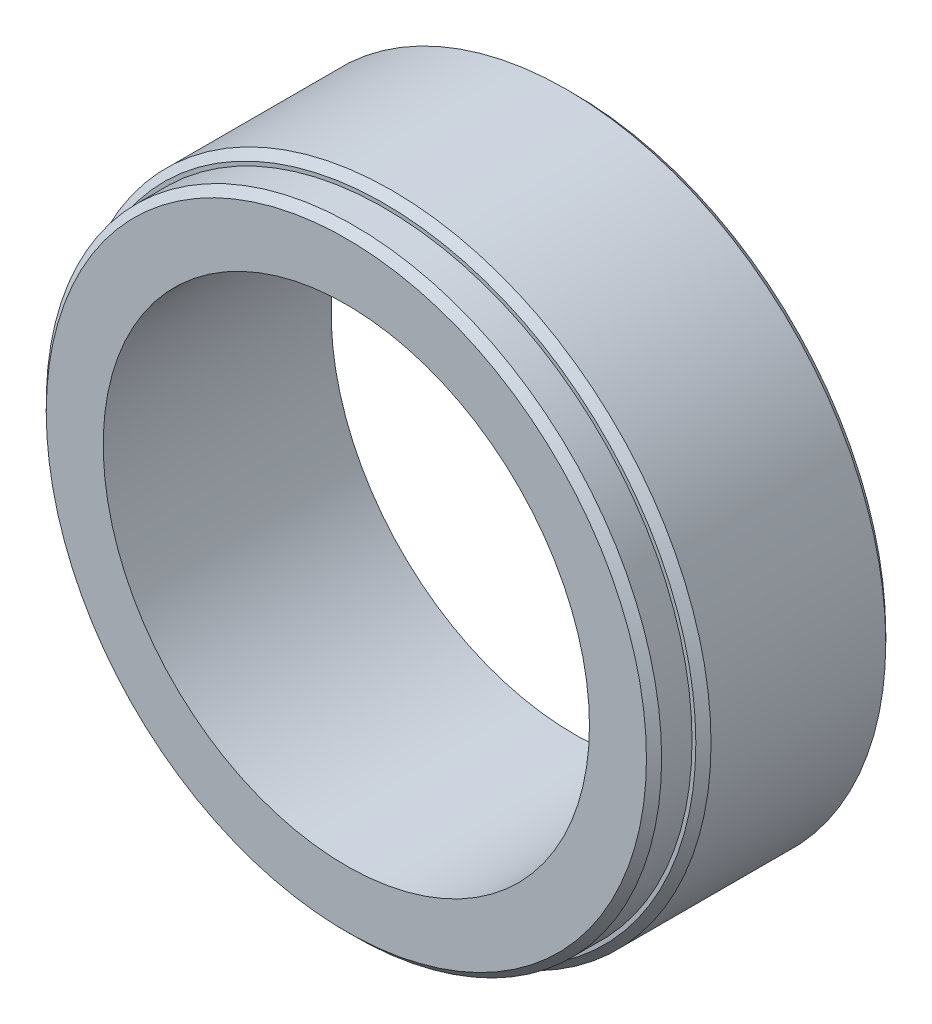
ISO-10303-21;
HEADER;
FILE_DESCRIPTION(('STEP AP214'),'2;1');
FILE_NAME('part.step','',(''),(''),'','','');
FILE_SCHEMA(('AUTOMOTIVE_DESIGN { 1 0 10303 214 1 1 1 1 }'));
ENDSEC;
DATA;
#1=APPLICATION_CONTEXT('core data for automotive mechanical design processes');
#2=APPLICATION_PROTOCOL_DEFINITION('international standard','automotive_design',2000,#1);
#3=PRODUCT_CONTEXT('',#1,'mechanical');
#4=PRODUCT('Part','Part','',(#3));
#5=PRODUCT_RELATED_PRODUCT_CATEGORY('part','',(#4));
#6=PRODUCT_DEFINITION_FORMATION('','',#4);
#7=PRODUCT_DEFINITION_CONTEXT('part definition',#1,'design');
#8=PRODUCT_DEFINITION('design','',#6,#7);
#9=PRODUCT_DEFINITION_SHAPE('','',#8);
#10=(LENGTH_UNIT() NAMED_UNIT(*) SI_UNIT(.MILLI.,.METRE.));
#11=(NAMED_UNIT(*) PLANE_ANGLE_UNIT() SI_UNIT($,.RADIAN.));
#12=(NAMED_UNIT(*) SI_UNIT($,.STERADIAN.) SOLID_ANGLE_UNIT());
#13=UNCERTAINTY_MEASURE_WITH_UNIT(LENGTH_MEASURE(1.E-05),#10,'distance_accuracy_value','');
#14=(GEOMETRIC_REPRESENTATION_CONTEXT(3) GLOBAL_UNCERTAINTY_ASSIGNED_CONTEXT((#13)) GLOBAL_UNIT_ASSIGNED_CONTEXT((#10,
#11,#12)) REPRESENTATION_CONTEXT('',''));
#15=CARTESIAN_POINT('',(0.,0.,0.));
#16=DIRECTION('',(0.,0.,1.));
#17=DIRECTION('',(1.,0.,0.));
#18=AXIS2_PLACEMENT_3D('',#15,#16,#17);
#19=CARTESIAN_POINT('',(0.,0.,25.));
#20=DIRECTION('',(0.,0.,1.));
#21=DIRECTION('',(1.,0.,0.));
#22=AXIS2_PLACEMENT_3D('',#19,#20,#21);
#23=PLANE('',#22);
#24=CARTESIAN_POINT('',(0.,0.,25.));
#25=DIRECTION('',(0.,0.,1.));
#26=DIRECTION('',(1.,0.,0.));
#27=AXIS2_PLACEMENT_3D('',#24,#25,#26);
#28=CIRCLE('',#27,41.);
#29=CARTESIAN_POINT('',(41.,0.,25.));
#30=VERTEX_POINT('',#29);
#31=EDGE_CURVE('E56',#30,#30,#28,.T.);
#32=ORIENTED_EDGE('',*,*,#31,.T.);
#33=EDGE_LOOP('',(#32));
#34=FACE_BOUND('',#33,.T.);
#35=CARTESIAN_POINT('',(0.,0.,25.));
#36=DIRECTION('',(0.,0.,1.));
#37=DIRECTION('',(1.,0.,0.));
#38=AXIS2_PLACEMENT_3D('',#35,#36,#37);
#39=CIRCLE('',#38,40.5);
#40=CARTESIAN_POINT('',(40.5,0.,25.));
#41=VERTEX_POINT('',#40);
#42=EDGE_CURVE('E75',#41,#41,#39,.T.);
#43=ORIENTED_EDGE('',*,*,#42,.F.);
#44=EDGE_LOOP('',(#43));
#45=FACE_BOUND('',#44,.T.);
#46=ADVANCED_FACE('F42',(#34,#45),#23,.T.);
#47=CARTESIAN_POINT('',(0.,0.,0.));
#48=DIRECTION('',(0.,0.,1.));
#49=DIRECTION('',(1.,0.,0.));
#50=AXIS2_PLACEMENT_3D('',#47,#48,#49);
#51=PLANE('',#50);
#52=CARTESIAN_POINT('',(0.,0.,0.));
#53=DIRECTION('',(0.,0.,1.));
#54=DIRECTION('',(1.,0.,0.));
#55=AXIS2_PLACEMENT_3D('',#52,#53,#54);
#56=CIRCLE('',#55,41.);
#57=CARTESIAN_POINT('',(41.,0.,0.));
#58=VERTEX_POINT('',#57);
#59=EDGE_CURVE('E61',#58,#58,#56,.F.);
#60=ORIENTED_EDGE('',*,*,#59,.T.);
#61=EDGE_LOOP('',(#60));
#62=FACE_BOUND('',#61,.T.);
#63=CARTESIAN_POINT('',(0.,0.,0.));
#64=DIRECTION('',(0.,0.,1.));
#65=DIRECTION('',(1.,0.,0.));
#66=AXIS2_PLACEMENT_3D('',#63,#64,#65);
#67=CIRCLE('',#66,32.);
#68=CARTESIAN_POINT('',(32.,0.,0.));
#69=VERTEX_POINT('',#68);
#70=EDGE_CURVE('E76',#69,#69,#67,.T.);
#71=ORIENTED_EDGE('',*,*,#70,.T.);
#72=EDGE_LOOP('',(#71));
#73=FACE_BOUND('',#72,.T.);
#74=ADVANCED_FACE('F104',(#62,#73),#51,.F.);
#75=CARTESIAN_POINT('',(0.,0.,25.));
#76=DIRECTION('',(0.,0.,-1.));
#77=DIRECTION('',(-1.,0.,0.));
#78=AXIS2_PLACEMENT_3D('',#75,#76,#77);
#79=CYLINDRICAL_SURFACE('',#78,42.);
#80=CARTESIAN_POINT('',(0.,0.,1.00000000000001));
#81=DIRECTION('',(0.,0.,1.));
#82=DIRECTION('',(1.,0.,0.));
#83=AXIS2_PLACEMENT_3D('',#80,#81,#82);
#84=CIRCLE('',#83,42.);
#85=CARTESIAN_POINT('',(42.,0.,1.00000000000001));
#86=VERTEX_POINT('',#85);
#87=EDGE_CURVE('E67',#86,#86,#84,.T.);
#88=ORIENTED_EDGE('',*,*,#87,.T.);
#89=EDGE_LOOP('',(#88));
#90=FACE_BOUND('',#89,.T.);
#91=CARTESIAN_POINT('',(0.,0.,24.));
#92=DIRECTION('',(0.,0.,1.));
#93=DIRECTION('',(1.,0.,0.));
#94=AXIS2_PLACEMENT_3D('',#91,#92,#93);
#95=CIRCLE('',#94,42.);
#96=CARTESIAN_POINT('',(42.,0.,24.));
#97=VERTEX_POINT('',#96);
#98=EDGE_CURVE('E71',#97,#97,#95,.F.);
#99=ORIENTED_EDGE('',*,*,#98,.T.);
#100=EDGE_LOOP('',(#99));
#101=FACE_BOUND('',#100,.T.);
#102=ADVANCED_FACE('F100',(#90,#101),#79,.T.);
#103=CARTESIAN_POINT('',(0.,0.,25.));
#104=DIRECTION('',(0.,0.,-1.));
#105=DIRECTION('',(-1.,0.,0.));
#106=AXIS2_PLACEMENT_3D('',#103,#104,#105);
#107=CYLINDRICAL_SURFACE('',#106,32.);
#108=ORIENTED_EDGE('',*,*,#70,.F.);
#109=EDGE_LOOP('',(#108));
#110=FACE_BOUND('',#109,.T.);
#111=CARTESIAN_POINT('',(0.,0.,30.));
#112=DIRECTION('',(0.,0.,1.));
#113=DIRECTION('',(1.,0.,0.));
#114=AXIS2_PLACEMENT_3D('',#111,#112,#113);
#115=CIRCLE('',#114,32.);
#116=CARTESIAN_POINT('',(32.,0.,30.));
#117=VERTEX_POINT('',#116);
#118=EDGE_CURVE('E80',#117,#117,#115,.T.);
#119=ORIENTED_EDGE('',*,*,#118,.T.);
#120=EDGE_LOOP('',(#119));
#121=FACE_BOUND('',#120,.T.);
#122=ADVANCED_FACE('F88',(#110,#121),#107,.F.);
#123=CARTESIAN_POINT('',(0.,0.,30.));
#124=DIRECTION('',(0.,0.,1.));
#125=DIRECTION('',(1.,0.,0.));
#126=AXIS2_PLACEMENT_3D('',#123,#124,#125);
#127=PLANE('',#126);
#128=CARTESIAN_POINT('',(0.,0.,30.));
#129=DIRECTION('',(0.,0.,1.));
#130=DIRECTION('',(1.,0.,0.));
#131=AXIS2_PLACEMENT_3D('',#128,#129,#130);
#132=CIRCLE('',#131,39.5);
#133=CARTESIAN_POINT('',(39.5,0.,30.));
#134=VERTEX_POINT('',#133);
#135=EDGE_CURVE('E51',#134,#134,#132,.T.);
#136=ORIENTED_EDGE('',*,*,#135,.T.);
#137=EDGE_LOOP('',(#136));
#138=FACE_BOUND('',#137,.T.);
#139=ORIENTED_EDGE('',*,*,#118,.F.);
#140=EDGE_LOOP('',(#139));
#141=FACE_BOUND('',#140,.T.);
#142=ADVANCED_FACE('F90',(#138,#141),#127,.T.);
#143=CARTESIAN_POINT('',(0.,0.,30.));
#144=DIRECTION('',(0.,0.,-1.));
#145=DIRECTION('',(-1.,0.,0.));
#146=AXIS2_PLACEMENT_3D('',#143,#144,#145);
#147=CYLINDRICAL_SURFACE('',#146,40.5);
#148=CARTESIAN_POINT('',(0.,0.,29.));
#149=DIRECTION('',(0.,0.,1.));
#150=DIRECTION('',(1.,0.,0.));
#151=AXIS2_PLACEMENT_3D('',#148,#149,#150);
#152=CIRCLE('',#151,40.5);
#153=CARTESIAN_POINT('',(40.5,0.,29.));
#154=VERTEX_POINT('',#153);
#155=EDGE_CURVE('E10',#154,#154,#152,.F.);
#156=ORIENTED_EDGE('',*,*,#155,.T.);
#157=EDGE_LOOP('',(#156));
#158=FACE_BOUND('',#157,.T.);
#159=ORIENTED_EDGE('',*,*,#42,.T.);
#160=EDGE_LOOP('',(#159));
#161=FACE_BOUND('',#160,.T.);
#162=ADVANCED_FACE('F92',(#158,#161),#147,.T.);
#163=CARTESIAN_POINT('',(0.,0.,1.00000000000001));
#164=DIRECTION('',(0.,0.,1.));
#165=DIRECTION('',(1.,0.,0.));
#166=AXIS2_PLACEMENT_3D('',#163,#164,#165);
#167=CONICAL_SURFACE('',#166,42.,0.785398163397448);
#168=ORIENTED_EDGE('',*,*,#59,.F.);
#169=EDGE_LOOP('',(#168));
#170=FACE_BOUND('',#169,.T.);
#171=ORIENTED_EDGE('',*,*,#87,.F.);
#172=EDGE_LOOP('',(#171));
#173=FACE_BOUND('',#172,.T.);
#174=ADVANCED_FACE('F98',(#170,#173),#167,.T.);
#175=CARTESIAN_POINT('',(0.,0.,25.));
#176=DIRECTION('',(0.,0.,-1.));
#177=DIRECTION('',(-1.,0.,0.));
#178=AXIS2_PLACEMENT_3D('',#175,#176,#177);
#179=CONICAL_SURFACE('',#178,41.,0.785398163397448);
#180=ORIENTED_EDGE('',*,*,#98,.F.);
#181=EDGE_LOOP('',(#180));
#182=FACE_BOUND('',#181,.T.);
#183=ORIENTED_EDGE('',*,*,#31,.F.);
#184=EDGE_LOOP('',(#183));
#185=FACE_BOUND('',#184,.T.);
#186=ADVANCED_FACE('F122',(#182,#185),#179,.T.);
#187=CARTESIAN_POINT('',(0.,0.,30.));
#188=DIRECTION('',(0.,0.,-1.));
#189=DIRECTION('',(-1.,0.,0.));
#190=AXIS2_PLACEMENT_3D('',#187,#188,#189);
#191=CONICAL_SURFACE('',#190,39.5,0.785398163397452);
#192=ORIENTED_EDGE('',*,*,#155,.F.);
#193=EDGE_LOOP('',(#192));
#194=FACE_BOUND('',#193,.T.);
#195=ORIENTED_EDGE('',*,*,#135,.F.);
#196=EDGE_LOOP('',(#195));
#197=FACE_BOUND('',#196,.T.);
#198=ADVANCED_FACE('F45',(#194,#197),#191,.T.);
#199=CLOSED_SHELL('',(#46,#74,#102,#122,#142,#162,#174,#186,#198));
#200=MANIFOLD_SOLID_BREP('B2',#199);
#201=ADVANCED_BREP_SHAPE_REPRESENTATION('',(#18,#200),#14);
#202=SHAPE_DEFINITION_REPRESENTATION(#9,#201);
ENDSEC;
END-ISO-10303-21;
